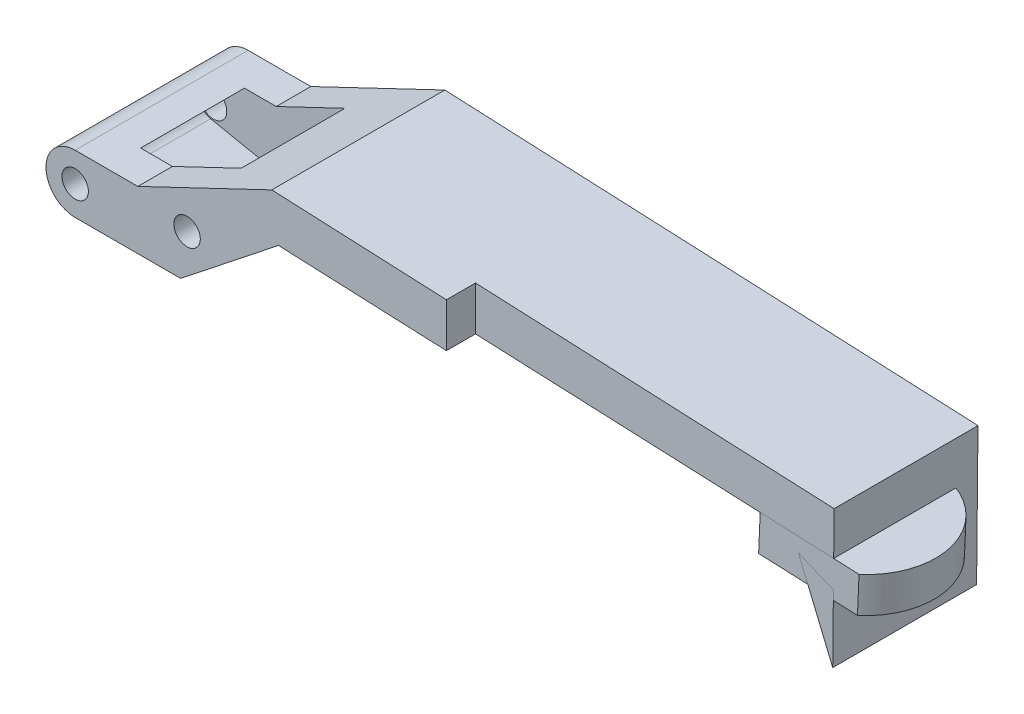
ISO-10303-21;
HEADER;
FILE_DESCRIPTION(('STEP AP214'),'2;1');
FILE_NAME('part.step','',(''),(''),'','','');
FILE_SCHEMA(('AUTOMOTIVE_DESIGN { 1 0 10303 214 1 1 1 1 }'));
ENDSEC;
DATA;
#1=APPLICATION_CONTEXT('core data for automotive mechanical design processes');
#2=APPLICATION_PROTOCOL_DEFINITION('international standard','automotive_design',2000,#1);
#3=PRODUCT_CONTEXT('',#1,'mechanical');
#4=PRODUCT('Part','Part','',(#3));
#5=PRODUCT_RELATED_PRODUCT_CATEGORY('part','',(#4));
#6=PRODUCT_DEFINITION_FORMATION('','',#4);
#7=PRODUCT_DEFINITION_CONTEXT('part definition',#1,'design');
#8=PRODUCT_DEFINITION('design','',#6,#7);
#9=PRODUCT_DEFINITION_SHAPE('','',#8);
#10=(LENGTH_UNIT() NAMED_UNIT(*) SI_UNIT(.MILLI.,.METRE.));
#11=(NAMED_UNIT(*) PLANE_ANGLE_UNIT() SI_UNIT($,.RADIAN.));
#12=(NAMED_UNIT(*) SI_UNIT($,.STERADIAN.) SOLID_ANGLE_UNIT());
#13=UNCERTAINTY_MEASURE_WITH_UNIT(LENGTH_MEASURE(1.E-05),#10,'distance_accuracy_value','');
#14=(GEOMETRIC_REPRESENTATION_CONTEXT(3) GLOBAL_UNCERTAINTY_ASSIGNED_CONTEXT((#13)) GLOBAL_UNIT_ASSIGNED_CONTEXT((#10,
#11,#12)) REPRESENTATION_CONTEXT('',''));
#15=CARTESIAN_POINT('',(0.,0.,0.));
#16=DIRECTION('',(0.,0.,1.));
#17=DIRECTION('',(1.,0.,0.));
#18=AXIS2_PLACEMENT_3D('',#15,#16,#17);
#19=CARTESIAN_POINT('',(69.4170686854287,12.3565905294232,14.8172482104849));
#20=DIRECTION('',(0.0429586518473279,0.999076851013705,0.));
#21=DIRECTION('',(-0.999076851013705,0.0429586518473279,0.));
#22=AXIS2_PLACEMENT_3D('',#19,#20,#21);
#23=CYLINDRICAL_SURFACE('',#22,20.);
#24=CARTESIAN_POINT('',(69.4170686854287,12.3565905294232,14.8172482104849));
#25=DIRECTION('',(-0.0429586518473279,-0.999076851013705,0.));
#26=DIRECTION('',(0.999076851013705,-0.0429586518473279,0.));
#27=AXIS2_PLACEMENT_3D('',#24,#25,#26);
#28=CIRCLE('',#27,20.);
#29=CARTESIAN_POINT('',(55.8495903388643,12.9399696540069,29.5));
#30=VERTEX_POINT('',#29);
#31=CARTESIAN_POINT('',(82.984547031993,11.7732114048395,29.5));
#32=VERTEX_POINT('',#31);
#33=EDGE_CURVE('E56',#30,#32,#28,.T.);
#34=ORIENTED_EDGE('',*,*,#33,.F.);
#35=DIRECTION('',(0.0429586518473279,0.999076851013705,0.));
#36=VECTOR('',#35,1.);
#37=CARTESIAN_POINT('',(55.8495903388643,12.9399696540069,29.5));
#38=LINE('',#37,#36);
#39=CARTESIAN_POINT('',(56.2791768573376,22.930738164144,29.5));
#40=VERTEX_POINT('',#39);
#41=EDGE_CURVE('E67',#30,#40,#38,.T.);
#42=ORIENTED_EDGE('',*,*,#41,.T.);
#43=CARTESIAN_POINT('',(69.8466552039019,22.3473590395603,14.8172482104849));
#44=DIRECTION('',(-0.0429586518473279,-0.999076851013705,0.));
#45=DIRECTION('',(0.999076851013705,-0.0429586518473279,0.));
#46=AXIS2_PLACEMENT_3D('',#43,#44,#45);
#47=CIRCLE('',#46,20.);
#48=CARTESIAN_POINT('',(83.4141335504662,21.7639799149766,29.5));
#49=VERTEX_POINT('',#48);
#50=EDGE_CURVE('E78',#40,#49,#47,.T.);
#51=ORIENTED_EDGE('',*,*,#50,.T.);
#52=DIRECTION('',(0.0429586518473279,0.999076851013705,0.));
#53=VECTOR('',#52,1.);
#54=CARTESIAN_POINT('',(82.984547031993,11.7732114048395,29.5));
#55=LINE('',#54,#53);
#56=EDGE_CURVE('E63',#49,#32,#55,.F.);
#57=ORIENTED_EDGE('',*,*,#56,.T.);
#58=EDGE_LOOP('',(#34,#42,#51,#57));
#59=FACE_BOUND('',#58,.T.);
#60=ADVANCED_FACE('F49',(#59),#23,.T.);
#61=CARTESIAN_POINT('',(69.4170686854287,12.3565905294232,14.8172482104849));
#62=DIRECTION('',(-0.0429586518473279,-0.999076851013705,0.));
#63=DIRECTION('',(0.999076851013705,-0.0429586518473279,0.));
#64=AXIS2_PLACEMENT_3D('',#61,#62,#63);
#65=PLANE('',#64);
#66=DIRECTION('',(0.999076851013705,-0.0429586518473279,0.));
#67=VECTOR('',#66,1.);
#68=CARTESIAN_POINT('',(69.4170686854287,12.3565905294232,29.5));
#69=LINE('',#68,#67);
#70=EDGE_CURVE('E80',#30,#32,#69,.T.);
#71=ORIENTED_EDGE('',*,*,#70,.F.);
#72=ORIENTED_EDGE('',*,*,#33,.T.);
#73=EDGE_LOOP('',(#71,#72));
#74=FACE_BOUND('',#73,.T.);
#75=ADVANCED_FACE('F87',(#74),#65,.T.);
#76=CARTESIAN_POINT('',(69.8466552039019,22.3473590395603,14.8172482104849));
#77=DIRECTION('',(-0.0429586518473279,-0.999076851013705,0.));
#78=DIRECTION('',(0.999076851013705,-0.0429586518473279,0.));
#79=AXIS2_PLACEMENT_3D('',#76,#77,#78);
#80=PLANE('',#79);
#81=ORIENTED_EDGE('',*,*,#50,.F.);
#82=DIRECTION('',(0.999076851013705,-0.0429586518473279,0.));
#83=VECTOR('',#82,1.);
#84=CARTESIAN_POINT('',(69.8466552039019,22.3473590395603,29.5));
#85=LINE('',#84,#83);
#86=EDGE_CURVE('E12',#40,#49,#85,.T.);
#87=ORIENTED_EDGE('',*,*,#86,.T.);
#88=EDGE_LOOP('',(#81,#87));
#89=FACE_BOUND('',#88,.T.);
#90=ADVANCED_FACE('F82',(#89),#80,.F.);
#91=CARTESIAN_POINT('',(0.,0.,29.5));
#92=DIRECTION('',(0.,0.,-1.));
#93=DIRECTION('',(-1.,0.,0.));
#94=AXIS2_PLACEMENT_3D('',#91,#92,#93);
#95=PLANE('',#94);
#96=ORIENTED_EDGE('',*,*,#70,.T.);
#97=ORIENTED_EDGE('',*,*,#56,.F.);
#98=ORIENTED_EDGE('',*,*,#86,.F.);
#99=ORIENTED_EDGE('',*,*,#41,.F.);
#100=EDGE_LOOP('',(#96,#97,#98,#99));
#101=FACE_BOUND('',#100,.T.);
#102=ADVANCED_FACE('F72',(#101),#95,.F.);
#103=CLOSED_SHELL('',(#60,#75,#90,#102));
#104=MANIFOLD_SOLID_BREP('B2',#103);
#105=CARTESIAN_POINT('',(-93.0725933015638,19.0392325507542,260.60568478364));
#106=DIRECTION('',(0.,0.,-1.));
#107=DIRECTION('',(-1.,0.,0.));
#108=AXIS2_PLACEMENT_3D('',#105,#106,#107);
#109=CYLINDRICAL_SURFACE('',#108,3.62850408907859);
#110=CARTESIAN_POINT('',(-93.0725933015638,19.0392325507542,-10.));
#111=DIRECTION('',(0.,0.,1.));
#112=DIRECTION('',(1.,0.,0.));
#113=AXIS2_PLACEMENT_3D('',#110,#111,#112);
#114=CIRCLE('',#113,3.62850408907859);
#115=CARTESIAN_POINT('',(-89.4440892124852,19.0392325507542,-10.));
#116=VERTEX_POINT('',#115);
#117=EDGE_CURVE('E304',#116,#116,#114,.F.);
#118=ORIENTED_EDGE('',*,*,#117,.T.);
#119=EDGE_LOOP('',(#118));
#120=FACE_BOUND('',#119,.T.);
#121=CARTESIAN_POINT('',(-93.0725933015638,19.0392325507542,-0.5));
#122=DIRECTION('',(0.,0.,1.));
#123=DIRECTION('',(1.,0.,0.));
#124=AXIS2_PLACEMENT_3D('',#121,#122,#123);
#125=CIRCLE('',#124,3.62850408907859);
#126=CARTESIAN_POINT('',(-89.4440892124852,19.0392325507542,-0.5));
#127=VERTEX_POINT('',#126);
#128=EDGE_CURVE('E362',#127,#127,#125,.T.);
#129=ORIENTED_EDGE('',*,*,#128,.T.);
#130=EDGE_LOOP('',(#129));
#131=FACE_BOUND('',#130,.T.);
#132=ADVANCED_FACE('F121',(#120,#131),#109,.F.);
#133=CARTESIAN_POINT('',(-94.8311183946456,7.,260.60568478364));
#134=DIRECTION('',(-0.620941950223322,0.783856552216576,0.));
#135=DIRECTION('',(-0.783856552216576,-0.620941950223322,0.));
#136=AXIS2_PLACEMENT_3D('',#133,#134,#135);
#137=PLANE('',#136);
#138=DIRECTION('',(0.783856552216576,0.620941950223322,0.));
#139=VECTOR('',#138,1.);
#140=CARTESIAN_POINT('',(-94.8311183946456,7.,-0.5));
#141=LINE('',#140,#139);
#142=CARTESIAN_POINT('',(-94.8311183946456,7.,-0.5));
#143=VERTEX_POINT('',#142);
#144=CARTESIAN_POINT('',(-79.0401530054826,19.509014330401,-0.5));
#145=VERTEX_POINT('',#144);
#146=EDGE_CURVE('E360',#143,#145,#141,.T.);
#147=ORIENTED_EDGE('',*,*,#146,.F.);
#148=DIRECTION('',(0.,0.,-1.));
#149=VECTOR('',#148,1.);
#150=CARTESIAN_POINT('',(-94.8311183946456,7.,260.60568478364));
#151=LINE('',#150,#149);
#152=CARTESIAN_POINT('',(-94.8311183946456,7.,-10.));
#153=VERTEX_POINT('',#152);
#154=EDGE_CURVE('E274',#143,#153,#151,.T.);
#155=ORIENTED_EDGE('',*,*,#154,.T.);
#156=DIRECTION('',(-0.783856552216576,-0.620941950223322,0.));
#157=VECTOR('',#156,1.);
#158=CARTESIAN_POINT('',(-94.8311183946456,7.,-10.));
#159=LINE('',#158,#157);
#160=CARTESIAN_POINT('',(-67.9761422699303,28.273511334347,-10.));
#161=VERTEX_POINT('',#160);
#162=EDGE_CURVE('E393',#161,#153,#159,.T.);
#163=ORIENTED_EDGE('',*,*,#162,.F.);
#164=DIRECTION('',(0.,0.,-1.));
#165=VECTOR('',#164,1.);
#166=CARTESIAN_POINT('',(-67.9761422699303,28.273511334347,260.60568478364));
#167=LINE('',#166,#165);
#168=CARTESIAN_POINT('',(-67.9761422699303,28.273511334347,37.5));
#169=VERTEX_POINT('',#168);
#170=EDGE_CURVE('E271',#169,#161,#167,.T.);
#171=ORIENTED_EDGE('',*,*,#170,.F.);
#172=DIRECTION('',(0.783856552216576,0.620941950223322,0.));
#173=VECTOR('',#172,1.);
#174=CARTESIAN_POINT('',(-94.8311183946456,7.,37.5));
#175=LINE('',#174,#173);
#176=CARTESIAN_POINT('',(-94.8311183946456,7.,37.5));
#177=VERTEX_POINT('',#176);
#178=EDGE_CURVE('E270',#177,#169,#175,.T.);
#179=ORIENTED_EDGE('',*,*,#178,.F.);
#180=CARTESIAN_POINT('',(-94.8311183946456,7.,28.));
#181=VERTEX_POINT('',#180);
#182=EDGE_CURVE('E280',#177,#181,#151,.T.);
#183=ORIENTED_EDGE('',*,*,#182,.T.);
#184=DIRECTION('',(0.783856552216576,0.620941950223322,0.));
#185=VECTOR('',#184,1.);
#186=CARTESIAN_POINT('',(-94.8311183946456,7.,28.));
#187=LINE('',#186,#185);
#188=CARTESIAN_POINT('',(-79.0401530054826,19.509014330401,28.));
#189=VERTEX_POINT('',#188);
#190=EDGE_CURVE('E144',#181,#189,#187,.T.);
#191=ORIENTED_EDGE('',*,*,#190,.T.);
#192=DIRECTION('',(0.,0.,1.));
#193=VECTOR('',#192,1.);
#194=CARTESIAN_POINT('',(-79.0401530054826,19.509014330401,-57.2848894963412));
#195=LINE('',#194,#193);
#196=EDGE_CURVE('E365',#189,#145,#195,.F.);
#197=ORIENTED_EDGE('',*,*,#196,.T.);
#198=EDGE_LOOP('',(#147,#155,#163,#171,#179,#183,#191,#197));
#199=FACE_BOUND('',#198,.T.);
#200=ADVANCED_FACE('F440',(#199),#137,.F.);
#201=CARTESIAN_POINT('',(-123.808315196469,7.,260.60568478364));
#202=DIRECTION('',(0.,1.,0.));
#203=DIRECTION('',(0.,0.,1.));
#204=AXIS2_PLACEMENT_3D('',#201,#202,#203);
#205=PLANE('',#204);
#206=DIRECTION('',(1.,0.,0.));
#207=VECTOR('',#206,1.);
#208=CARTESIAN_POINT('',(-123.808315196469,7.,-0.5));
#209=LINE('',#208,#207);
#210=CARTESIAN_POINT('',(-104.395423960864,7.,-0.5));
#211=VERTEX_POINT('',#210);
#212=EDGE_CURVE('E326',#211,#143,#209,.T.);
#213=ORIENTED_EDGE('',*,*,#212,.F.);
#214=DIRECTION('',(0.,0.,1.));
#215=VECTOR('',#214,1.);
#216=CARTESIAN_POINT('',(-104.395423960864,7.,260.60568478364));
#217=LINE('',#216,#215);
#218=CARTESIAN_POINT('',(-104.395423960864,7.,28.));
#219=VERTEX_POINT('',#218);
#220=EDGE_CURVE('E258',#211,#219,#217,.T.);
#221=ORIENTED_EDGE('',*,*,#220,.T.);
#222=DIRECTION('',(1.,0.,0.));
#223=VECTOR('',#222,1.);
#224=CARTESIAN_POINT('',(-123.808315196469,7.,28.));
#225=LINE('',#224,#223);
#226=EDGE_CURVE('E324',#219,#181,#225,.T.);
#227=ORIENTED_EDGE('',*,*,#226,.T.);
#228=ORIENTED_EDGE('',*,*,#182,.F.);
#229=DIRECTION('',(1.,0.,0.));
#230=VECTOR('',#229,1.);
#231=CARTESIAN_POINT('',(-123.808315196469,7.,37.5));
#232=LINE('',#231,#230);
#233=CARTESIAN_POINT('',(-123.808315196469,7.,37.5));
#234=VERTEX_POINT('',#233);
#235=EDGE_CURVE('E403',#234,#177,#232,.T.);
#236=ORIENTED_EDGE('',*,*,#235,.F.);
#237=DIRECTION('',(0.,0.,-1.));
#238=VECTOR('',#237,1.);
#239=CARTESIAN_POINT('',(-123.808315196469,7.,260.60568478364));
#240=LINE('',#239,#238);
#241=CARTESIAN_POINT('',(-123.808315196469,7.,-10.));
#242=VERTEX_POINT('',#241);
#243=EDGE_CURVE('E283',#234,#242,#240,.T.);
#244=ORIENTED_EDGE('',*,*,#243,.T.);
#245=DIRECTION('',(-1.,0.,0.));
#246=VECTOR('',#245,1.);
#247=CARTESIAN_POINT('',(-123.808315196469,7.,-10.));
#248=LINE('',#247,#246);
#249=EDGE_CURVE('E390',#153,#242,#248,.T.);
#250=ORIENTED_EDGE('',*,*,#249,.F.);
#251=ORIENTED_EDGE('',*,*,#154,.F.);
#252=EDGE_LOOP('',(#213,#221,#227,#228,#236,#244,#250,#251));
#253=FACE_BOUND('',#252,.T.);
#254=ADVANCED_FACE('F323',(#253),#205,.F.);
#255=CARTESIAN_POINT('',(-123.808315196469,23.,260.60568478364));
#256=DIRECTION('',(0.,-1.,0.));
#257=DIRECTION('',(0.,0.,-1.));
#258=AXIS2_PLACEMENT_3D('',#255,#256,#257);
#259=PLANE('',#258);
#260=DIRECTION('',(-1.,0.,0.));
#261=VECTOR('',#260,1.);
#262=CARTESIAN_POINT('',(-123.808315196469,23.,-0.5));
#263=LINE('',#262,#261);
#264=CARTESIAN_POINT('',(-106.59703978523,23.,-0.5));
#265=VERTEX_POINT('',#264);
#266=CARTESIAN_POINT('',(-115.332613788955,23.,-0.5));
#267=VERTEX_POINT('',#266);
#268=EDGE_CURVE('E357',#265,#267,#263,.T.);
#269=ORIENTED_EDGE('',*,*,#268,.F.);
#270=DIRECTION('',(0.,0.,-1.));
#271=VECTOR('',#270,1.);
#272=CARTESIAN_POINT('',(-106.59703978523,23.,260.60568478364));
#273=LINE('',#272,#271);
#274=CARTESIAN_POINT('',(-106.59703978523,23.,-10.));
#275=VERTEX_POINT('',#274);
#276=EDGE_CURVE('E287',#265,#275,#273,.T.);
#277=ORIENTED_EDGE('',*,*,#276,.T.);
#278=DIRECTION('',(1.,0.,0.));
#279=VECTOR('',#278,1.);
#280=CARTESIAN_POINT('',(-123.808315196469,23.,-10.));
#281=LINE('',#280,#279);
#282=CARTESIAN_POINT('',(-123.808315196469,23.,-10.));
#283=VERTEX_POINT('',#282);
#284=EDGE_CURVE('E384',#283,#275,#281,.T.);
#285=ORIENTED_EDGE('',*,*,#284,.F.);
#286=DIRECTION('',(0.,0.,-1.));
#287=VECTOR('',#286,1.);
#288=CARTESIAN_POINT('',(-123.808315196469,23.,260.60568478364));
#289=LINE('',#288,#287);
#290=CARTESIAN_POINT('',(-123.808315196469,23.,37.5));
#291=VERTEX_POINT('',#290);
#292=EDGE_CURVE('E285',#291,#283,#289,.T.);
#293=ORIENTED_EDGE('',*,*,#292,.F.);
#294=DIRECTION('',(-1.,0.,0.));
#295=VECTOR('',#294,1.);
#296=CARTESIAN_POINT('',(-123.808315196469,23.,37.5));
#297=LINE('',#296,#295);
#298=CARTESIAN_POINT('',(-106.59703978523,23.,37.5));
#299=VERTEX_POINT('',#298);
#300=EDGE_CURVE('E408',#299,#291,#297,.T.);
#301=ORIENTED_EDGE('',*,*,#300,.F.);
#302=CARTESIAN_POINT('',(-106.59703978523,23.,28.));
#303=VERTEX_POINT('',#302);
#304=EDGE_CURVE('E288',#299,#303,#273,.T.);
#305=ORIENTED_EDGE('',*,*,#304,.T.);
#306=DIRECTION('',(-1.,0.,0.));
#307=VECTOR('',#306,1.);
#308=CARTESIAN_POINT('',(-123.808315196469,23.,28.));
#309=LINE('',#308,#307);
#310=CARTESIAN_POINT('',(-115.332613788955,23.,28.));
#311=VERTEX_POINT('',#310);
#312=EDGE_CURVE('E349',#303,#311,#309,.T.);
#313=ORIENTED_EDGE('',*,*,#312,.T.);
#314=DIRECTION('',(0.,0.,-1.));
#315=VECTOR('',#314,1.);
#316=CARTESIAN_POINT('',(-115.332613788955,23.,260.60568478364));
#317=LINE('',#316,#315);
#318=EDGE_CURVE('E317',#311,#267,#317,.T.);
#319=ORIENTED_EDGE('',*,*,#318,.T.);
#320=EDGE_LOOP('',(#269,#277,#285,#293,#301,#305,#313,#319));
#321=FACE_BOUND('',#320,.T.);
#322=ADVANCED_FACE('F450',(#321),#259,.F.);
#323=CARTESIAN_POINT('',(-106.59703978523,23.,260.60568478364));
#324=DIRECTION('',(0.430894593675026,-0.902402265700632,0.));
#325=DIRECTION('',(0.902402265700632,0.430894593675026,0.));
#326=AXIS2_PLACEMENT_3D('',#323,#324,#325);
#327=PLANE('',#326);
#328=DIRECTION('',(-0.902402265700632,-0.430894593675026,0.));
#329=VECTOR('',#328,1.);
#330=CARTESIAN_POINT('',(-106.59703978523,23.,-0.5));
#331=LINE('',#330,#329);
#332=CARTESIAN_POINT('',(-87.7138484569898,32.0166717925431,-0.5));
#333=VERTEX_POINT('',#332);
#334=EDGE_CURVE('E313',#333,#265,#331,.T.);
#335=ORIENTED_EDGE('',*,*,#334,.F.);
#336=DIRECTION('',(0.,0.,1.));
#337=VECTOR('',#336,1.);
#338=CARTESIAN_POINT('',(-87.7138484569898,32.0166717925431,-57.2848894963412));
#339=LINE('',#338,#337);
#340=CARTESIAN_POINT('',(-87.7138484569898,32.0166717925431,28.));
#341=VERTEX_POINT('',#340);
#342=EDGE_CURVE('E299',#333,#341,#339,.T.);
#343=ORIENTED_EDGE('',*,*,#342,.T.);
#344=DIRECTION('',(-0.902402265700632,-0.430894593675026,0.));
#345=VECTOR('',#344,1.);
#346=CARTESIAN_POINT('',(-106.59703978523,23.,28.));
#347=LINE('',#346,#345);
#348=EDGE_CURVE('E308',#341,#303,#347,.T.);
#349=ORIENTED_EDGE('',*,*,#348,.T.);
#350=ORIENTED_EDGE('',*,*,#304,.F.);
#351=DIRECTION('',(-0.902402265700632,-0.430894593675026,0.));
#352=VECTOR('',#351,1.);
#353=CARTESIAN_POINT('',(-106.59703978523,23.,37.5));
#354=LINE('',#353,#352);
#355=CARTESIAN_POINT('',(-69.8134079377296,40.5640827835406,37.5));
#356=VERTEX_POINT('',#355);
#357=EDGE_CURVE('E276',#356,#299,#354,.T.);
#358=ORIENTED_EDGE('',*,*,#357,.F.);
#359=DIRECTION('',(0.,0.,-1.));
#360=VECTOR('',#359,1.);
#361=CARTESIAN_POINT('',(-69.8134079377296,40.5640827835406,260.60568478364));
#362=LINE('',#361,#360);
#363=CARTESIAN_POINT('',(-69.8134079377296,40.5640827835406,-10.));
#364=VERTEX_POINT('',#363);
#365=EDGE_CURVE('E291',#356,#364,#362,.T.);
#366=ORIENTED_EDGE('',*,*,#365,.T.);
#367=DIRECTION('',(0.902402265700632,0.430894593675026,0.));
#368=VECTOR('',#367,1.);
#369=CARTESIAN_POINT('',(-106.59703978523,23.,-10.));
#370=LINE('',#369,#368);
#371=EDGE_CURVE('E381',#275,#364,#370,.T.);
#372=ORIENTED_EDGE('',*,*,#371,.F.);
#373=ORIENTED_EDGE('',*,*,#276,.F.);
#374=EDGE_LOOP('',(#335,#343,#349,#350,#358,#366,#372,#373));
#375=FACE_BOUND('',#374,.T.);
#376=ADVANCED_FACE('F416',(#375),#327,.F.);
#377=CARTESIAN_POINT('',(-123.808315196469,15.,260.60568478364));
#378=DIRECTION('',(0.,0.,-1.));
#379=DIRECTION('',(-1.,0.,0.));
#380=AXIS2_PLACEMENT_3D('',#377,#378,#379);
#381=CYLINDRICAL_SURFACE('',#380,3.62850408907861);
#382=CARTESIAN_POINT('',(-123.808315196469,15.,-10.));
#383=DIRECTION('',(0.,0.,1.));
#384=DIRECTION('',(1.,0.,0.));
#385=AXIS2_PLACEMENT_3D('',#382,#383,#384);
#386=CIRCLE('',#385,3.62850408907861);
#387=CARTESIAN_POINT('',(-120.17981110739,15.,-10.));
#388=VERTEX_POINT('',#387);
#389=EDGE_CURVE('E371',#388,#388,#386,.F.);
#390=ORIENTED_EDGE('',*,*,#389,.T.);
#391=EDGE_LOOP('',(#390));
#392=FACE_BOUND('',#391,.T.);
#393=CARTESIAN_POINT('',(-123.808315196469,15.,-0.5));
#394=DIRECTION('',(0.,0.,1.));
#395=DIRECTION('',(1.,0.,0.));
#396=AXIS2_PLACEMENT_3D('',#393,#394,#395);
#397=CIRCLE('',#396,3.62850408907861);
#398=CARTESIAN_POINT('',(-120.17981110739,15.,-0.5));
#399=VERTEX_POINT('',#398);
#400=EDGE_CURVE('E310',#399,#399,#397,.T.);
#401=ORIENTED_EDGE('',*,*,#400,.T.);
#402=EDGE_LOOP('',(#401));
#403=FACE_BOUND('',#402,.T.);
#404=ADVANCED_FACE('F502',(#392,#403),#381,.F.);
#405=CARTESIAN_POINT('',(-93.0725933015638,19.0392325507542,28.));
#406=DIRECTION('',(0.,0.,1.));
#407=DIRECTION('',(1.,0.,0.));
#408=AXIS2_PLACEMENT_3D('',#405,#406,#407);
#409=CIRCLE('',#408,3.62850408907859);
#410=CARTESIAN_POINT('',(-89.4440892124852,19.0392325507542,28.));
#411=VERTEX_POINT('',#410);
#412=EDGE_CURVE('E314',#411,#411,#409,.T.);
#413=ORIENTED_EDGE('',*,*,#412,.F.);
#414=EDGE_LOOP('',(#413));
#415=FACE_BOUND('',#414,.T.);
#416=CARTESIAN_POINT('',(-93.0725933015638,19.0392325507542,37.5));
#417=DIRECTION('',(0.,0.,1.));
#418=DIRECTION('',(1.,0.,0.));
#419=AXIS2_PLACEMENT_3D('',#416,#417,#418);
#420=CIRCLE('',#419,3.62850408907859);
#421=CARTESIAN_POINT('',(-89.4440892124852,19.0392325507542,37.5));
#422=VERTEX_POINT('',#421);
#423=EDGE_CURVE('E303',#422,#422,#420,.T.);
#424=ORIENTED_EDGE('',*,*,#423,.T.);
#425=EDGE_LOOP('',(#424));
#426=FACE_BOUND('',#425,.T.);
#427=ADVANCED_FACE('F493',(#415,#426),#109,.F.);
#428=CARTESIAN_POINT('',(-123.808315196469,15.,260.60568478364));
#429=DIRECTION('',(0.,0.,-1.));
#430=DIRECTION('',(-1.,0.,0.));
#431=AXIS2_PLACEMENT_3D('',#428,#429,#430);
#432=CYLINDRICAL_SURFACE('',#431,8.);
#433=CARTESIAN_POINT('',(-123.808315196469,15.,37.5));
#434=DIRECTION('',(0.,0.,1.));
#435=DIRECTION('',(1.,0.,0.));
#436=AXIS2_PLACEMENT_3D('',#433,#434,#435);
#437=CIRCLE('',#436,8.);
#438=EDGE_CURVE('E405',#291,#234,#437,.T.);
#439=ORIENTED_EDGE('',*,*,#438,.F.);
#440=ORIENTED_EDGE('',*,*,#292,.T.);
#441=CARTESIAN_POINT('',(-123.808315196469,15.,-10.));
#442=DIRECTION('',(0.,0.,1.));
#443=DIRECTION('',(1.,0.,0.));
#444=AXIS2_PLACEMENT_3D('',#441,#442,#443);
#445=CIRCLE('',#444,8.);
#446=EDGE_CURVE('E387',#242,#283,#445,.F.);
#447=ORIENTED_EDGE('',*,*,#446,.F.);
#448=ORIENTED_EDGE('',*,*,#243,.F.);
#449=EDGE_LOOP('',(#439,#440,#447,#448));
#450=FACE_BOUND('',#449,.T.);
#451=ADVANCED_FACE('F445',(#450),#432,.T.);
#452=CARTESIAN_POINT('',(-69.8134079377296,40.5640827835406,260.60568478364));
#453=DIRECTION('',(-0.0450408761212035,-0.998985144773552,0.));
#454=DIRECTION('',(0.998985144773552,-0.0450408761212035,0.));
#455=AXIS2_PLACEMENT_3D('',#452,#453,#454);
#456=PLANE('',#455);
#457=DIRECTION('',(-0.998985144773552,0.0450408761212035,0.));
#458=VECTOR('',#457,1.);
#459=CARTESIAN_POINT('',(-69.8134079377296,40.5640827835406,37.5));
#460=LINE('',#459,#458);
#461=CARTESIAN_POINT('',(-21.8746114044652,38.402683880513,37.5));
#462=VERTEX_POINT('',#461);
#463=EDGE_CURVE('E272',#462,#356,#460,.T.);
#464=ORIENTED_EDGE('',*,*,#463,.F.);
#465=DIRECTION('',(0.,0.,-1.));
#466=VECTOR('',#465,1.);
#467=CARTESIAN_POINT('',(-21.8746114044652,38.402683880513,260.60568478364));
#468=LINE('',#467,#466);
#469=CARTESIAN_POINT('',(-21.8746114044652,38.402683880513,29.5));
#470=VERTEX_POINT('',#469);
#471=EDGE_CURVE('E136',#462,#470,#468,.T.);
#472=ORIENTED_EDGE('',*,*,#471,.T.);
#473=DIRECTION('',(0.998985144773552,-0.0450408761212035,0.));
#474=VECTOR('',#473,1.);
#475=CARTESIAN_POINT('',(-69.8134079377296,40.5640827835406,29.5));
#476=LINE('',#475,#474);
#477=CARTESIAN_POINT('',(76.5795177343592,33.9637187393768,29.5));
#478=VERTEX_POINT('',#477);
#479=EDGE_CURVE('E465',#470,#478,#476,.T.);
#480=ORIENTED_EDGE('',*,*,#479,.T.);
#481=DIRECTION('',(0.,0.,-1.));
#482=VECTOR('',#481,1.);
#483=CARTESIAN_POINT('',(76.5795177343592,33.9637187393768,260.60568478364));
#484=LINE('',#483,#482);
#485=CARTESIAN_POINT('',(76.5795177343592,33.9637187393768,-10.));
#486=VERTEX_POINT('',#485);
#487=EDGE_CURVE('E293',#478,#486,#484,.T.);
#488=ORIENTED_EDGE('',*,*,#487,.T.);
#489=DIRECTION('',(0.998985144773552,-0.0450408761212035,0.));
#490=VECTOR('',#489,1.);
#491=CARTESIAN_POINT('',(-69.8134079377296,40.5640827835406,-10.));
#492=LINE('',#491,#490);
#493=EDGE_CURVE('E378',#364,#486,#492,.T.);
#494=ORIENTED_EDGE('',*,*,#493,.F.);
#495=ORIENTED_EDGE('',*,*,#365,.F.);
#496=EDGE_LOOP('',(#464,#472,#480,#488,#494,#495));
#497=FACE_BOUND('',#496,.T.);
#498=ADVANCED_FACE('F420',(#497),#456,.F.);
#499=CARTESIAN_POINT('',(76.5795177343592,33.9637187393768,260.60568478364));
#500=DIRECTION('',(-0.999947901593243,0.0102075510907739,0.));
#501=DIRECTION('',(-0.0102075510907739,-0.999947901593243,0.));
#502=AXIS2_PLACEMENT_3D('',#499,#500,#501);
#503=PLANE('',#502);
#504=ORIENTED_EDGE('',*,*,#487,.F.);
#505=DIRECTION('',(-0.0102075510907739,-0.999947901593243,0.));
#506=VECTOR('',#505,1.);
#507=CARTESIAN_POINT('',(76.5795177343592,33.9637187393768,29.5));
#508=LINE('',#507,#506);
#509=CARTESIAN_POINT('',(76.1916848035314,-4.02901055497371,29.5));
#510=VERTEX_POINT('',#509);
#511=EDGE_CURVE('E432',#478,#510,#508,.T.);
#512=ORIENTED_EDGE('',*,*,#511,.T.);
#513=DIRECTION('',(0.,0.,-1.));
#514=VECTOR('',#513,1.);
#515=CARTESIAN_POINT('',(76.1916848035314,-4.0290105549737,260.60568478364));
#516=LINE('',#515,#514);
#517=CARTESIAN_POINT('',(76.1916848035314,-4.0290105549737,-10.));
#518=VERTEX_POINT('',#517);
#519=EDGE_CURVE('E295',#510,#518,#516,.T.);
#520=ORIENTED_EDGE('',*,*,#519,.T.);
#521=DIRECTION('',(-0.0102075510907739,-0.999947901593243,0.));
#522=VECTOR('',#521,1.);
#523=CARTESIAN_POINT('',(76.5795177343592,33.9637187393768,-10.));
#524=LINE('',#523,#522);
#525=EDGE_CURVE('E368',#486,#518,#524,.T.);
#526=ORIENTED_EDGE('',*,*,#525,.F.);
#527=EDGE_LOOP('',(#504,#512,#520,#526));
#528=FACE_BOUND('',#527,.T.);
#529=ADVANCED_FACE('F429',(#528),#503,.F.);
#530=CARTESIAN_POINT('',(76.1916848035314,-4.0290105549737,260.60568478364));
#531=DIRECTION('',(0.923006832616529,0.384783558566635,0.));
#532=DIRECTION('',(-0.384783558566635,0.923006832616529,0.));
#533=AXIS2_PLACEMENT_3D('',#530,#531,#532);
#534=PLANE('',#533);
#535=ORIENTED_EDGE('',*,*,#519,.F.);
#536=DIRECTION('',(-0.384783558566635,0.923006832616529,0.));
#537=VECTOR('',#536,1.);
#538=CARTESIAN_POINT('',(76.1916848035314,-4.0290105549737,29.5));
#539=LINE('',#538,#537);
#540=CARTESIAN_POINT('',(65.1110030296393,22.5509842489901,29.5));
#541=VERTEX_POINT('',#540);
#542=EDGE_CURVE('E436',#510,#541,#539,.T.);
#543=ORIENTED_EDGE('',*,*,#542,.T.);
#544=DIRECTION('',(0.,0.,-1.));
#545=VECTOR('',#544,1.);
#546=CARTESIAN_POINT('',(65.1110030296393,22.5509842489901,260.60568478364));
#547=LINE('',#546,#545);
#548=CARTESIAN_POINT('',(65.1110030296393,22.5509842489901,-10.));
#549=VERTEX_POINT('',#548);
#550=EDGE_CURVE('E297',#541,#549,#547,.T.);
#551=ORIENTED_EDGE('',*,*,#550,.T.);
#552=DIRECTION('',(-0.384783558566635,0.923006832616529,0.));
#553=VECTOR('',#552,1.);
#554=CARTESIAN_POINT('',(76.1916848035314,-4.0290105549737,-10.));
#555=LINE('',#554,#553);
#556=EDGE_CURVE('E372',#518,#549,#555,.T.);
#557=ORIENTED_EDGE('',*,*,#556,.F.);
#558=EDGE_LOOP('',(#535,#543,#551,#557));
#559=FACE_BOUND('',#558,.T.);
#560=ADVANCED_FACE('F435',(#559),#534,.F.);
#561=CARTESIAN_POINT('',(-67.9761422699303,28.273511334347,260.60568478364));
#562=DIRECTION('',(0.0429586518473279,0.999076851013704,0.));
#563=DIRECTION('',(-0.999076851013705,0.0429586518473279,0.));
#564=AXIS2_PLACEMENT_3D('',#561,#562,#563);
#565=PLANE('',#564);
#566=DIRECTION('',(-0.999076851013705,0.0429586518473279,0.));
#567=VECTOR('',#566,1.);
#568=CARTESIAN_POINT('',(-67.9761422699303,28.273511334347,29.5));
#569=LINE('',#568,#567);
#570=CARTESIAN_POINT('',(-21.8746114044652,26.2912217716683,29.5));
#571=VERTEX_POINT('',#570);
#572=EDGE_CURVE('E47',#541,#571,#569,.T.);
#573=ORIENTED_EDGE('',*,*,#572,.T.);
#574=DIRECTION('',(0.,0.,1.));
#575=VECTOR('',#574,1.);
#576=CARTESIAN_POINT('',(-21.8746114044652,26.2912217716683,260.60568478364));
#577=LINE('',#576,#575);
#578=CARTESIAN_POINT('',(-21.8746114044652,26.2912217716683,37.5));
#579=VERTEX_POINT('',#578);
#580=EDGE_CURVE('E253',#571,#579,#577,.T.);
#581=ORIENTED_EDGE('',*,*,#580,.T.);
#582=DIRECTION('',(0.999076851013705,-0.0429586518473279,0.));
#583=VECTOR('',#582,1.);
#584=CARTESIAN_POINT('',(-67.9761422699303,28.273511334347,37.5));
#585=LINE('',#584,#583);
#586=EDGE_CURVE('E261',#169,#579,#585,.T.);
#587=ORIENTED_EDGE('',*,*,#586,.F.);
#588=ORIENTED_EDGE('',*,*,#170,.T.);
#589=DIRECTION('',(-0.999076851013705,0.0429586518473279,0.));
#590=VECTOR('',#589,1.);
#591=CARTESIAN_POINT('',(-67.9761422699303,28.273511334347,-10.));
#592=LINE('',#591,#590);
#593=EDGE_CURVE('E375',#549,#161,#592,.T.);
#594=ORIENTED_EDGE('',*,*,#593,.F.);
#595=ORIENTED_EDGE('',*,*,#550,.F.);
#596=EDGE_LOOP('',(#573,#581,#587,#588,#594,#595));
#597=FACE_BOUND('',#596,.T.);
#598=ADVANCED_FACE('F123',(#597),#565,.F.);
#599=CARTESIAN_POINT('',(-123.808315196469,15.,28.));
#600=DIRECTION('',(0.,0.,1.));
#601=DIRECTION('',(1.,0.,0.));
#602=AXIS2_PLACEMENT_3D('',#599,#600,#601);
#603=CIRCLE('',#602,3.62850408907861);
#604=CARTESIAN_POINT('',(-120.17981110739,15.,28.));
#605=VERTEX_POINT('',#604);
#606=EDGE_CURVE('E305',#605,#605,#603,.T.);
#607=ORIENTED_EDGE('',*,*,#606,.F.);
#608=EDGE_LOOP('',(#607));
#609=FACE_BOUND('',#608,.T.);
#610=CARTESIAN_POINT('',(-123.808315196469,15.,37.5));
#611=DIRECTION('',(0.,0.,1.));
#612=DIRECTION('',(1.,0.,0.));
#613=AXIS2_PLACEMENT_3D('',#610,#611,#612);
#614=CIRCLE('',#613,3.62850408907861);
#615=CARTESIAN_POINT('',(-120.17981110739,15.,37.5));
#616=VERTEX_POINT('',#615);
#617=EDGE_CURVE('E300',#616,#616,#614,.T.);
#618=ORIENTED_EDGE('',*,*,#617,.T.);
#619=EDGE_LOOP('',(#618));
#620=FACE_BOUND('',#619,.T.);
#621=ADVANCED_FACE('F511',(#609,#620),#381,.F.);
#622=CARTESIAN_POINT('',(0.,0.,37.5));
#623=DIRECTION('',(0.,0.,1.));
#624=DIRECTION('',(1.,0.,0.));
#625=AXIS2_PLACEMENT_3D('',#622,#623,#624);
#626=PLANE('',#625);
#627=DIRECTION('',(0.,-1.,0.));
#628=VECTOR('',#627,1.);
#629=CARTESIAN_POINT('',(-21.8746114044652,0.,37.5));
#630=LINE('',#629,#628);
#631=EDGE_CURVE('E129',#462,#579,#630,.T.);
#632=ORIENTED_EDGE('',*,*,#631,.F.);
#633=ORIENTED_EDGE('',*,*,#463,.T.);
#634=ORIENTED_EDGE('',*,*,#357,.T.);
#635=ORIENTED_EDGE('',*,*,#300,.T.);
#636=ORIENTED_EDGE('',*,*,#438,.T.);
#637=ORIENTED_EDGE('',*,*,#235,.T.);
#638=ORIENTED_EDGE('',*,*,#178,.T.);
#639=ORIENTED_EDGE('',*,*,#586,.T.);
#640=EDGE_LOOP('',(#632,#633,#634,#635,#636,#637,#638,#639));
#641=FACE_BOUND('',#640,.T.);
#642=ORIENTED_EDGE('',*,*,#617,.F.);
#643=EDGE_LOOP('',(#642));
#644=FACE_BOUND('',#643,.T.);
#645=ORIENTED_EDGE('',*,*,#423,.F.);
#646=EDGE_LOOP('',(#645));
#647=FACE_BOUND('',#646,.T.);
#648=ADVANCED_FACE('F266',(#641,#644,#647),#626,.T.);
#649=CARTESIAN_POINT('',(0.,0.,-10.));
#650=DIRECTION('',(0.,0.,1.));
#651=DIRECTION('',(1.,0.,0.));
#652=AXIS2_PLACEMENT_3D('',#649,#650,#651);
#653=PLANE('',#652);
#654=ORIENTED_EDGE('',*,*,#593,.T.);
#655=ORIENTED_EDGE('',*,*,#162,.T.);
#656=ORIENTED_EDGE('',*,*,#249,.T.);
#657=ORIENTED_EDGE('',*,*,#446,.T.);
#658=ORIENTED_EDGE('',*,*,#284,.T.);
#659=ORIENTED_EDGE('',*,*,#371,.T.);
#660=ORIENTED_EDGE('',*,*,#493,.T.);
#661=ORIENTED_EDGE('',*,*,#525,.T.);
#662=ORIENTED_EDGE('',*,*,#556,.T.);
#663=EDGE_LOOP('',(#654,#655,#656,#657,#658,#659,#660,#661,#662));
#664=FACE_BOUND('',#663,.T.);
#665=ORIENTED_EDGE('',*,*,#389,.F.);
#666=EDGE_LOOP('',(#665));
#667=FACE_BOUND('',#666,.T.);
#668=ORIENTED_EDGE('',*,*,#117,.F.);
#669=EDGE_LOOP('',(#668));
#670=FACE_BOUND('',#669,.T.);
#671=ADVANCED_FACE('F425',(#664,#667,#670),#653,.F.);
#672=CARTESIAN_POINT('',(-124.59993708417,11.0752673981965,-57.2848894963412));
#673=DIRECTION('',(-0.197719016838428,-0.980258736446886,0.));
#674=DIRECTION('',(0.980258736446886,-0.197719016838428,0.));
#675=AXIS2_PLACEMENT_3D('',#672,#673,#674);
#676=PLANE('',#675);
#677=DIRECTION('',(-0.980258736446886,0.197719016838428,0.));
#678=VECTOR('',#677,1.);
#679=CARTESIAN_POINT('',(-124.59993708417,11.0752673981965,-0.5));
#680=LINE('',#679,#678);
#681=CARTESIAN_POINT('',(-124.59993708417,11.0752673981965,-0.5));
#682=VERTEX_POINT('',#681);
#683=EDGE_CURVE('E309',#211,#682,#680,.T.);
#684=ORIENTED_EDGE('',*,*,#683,.T.);
#685=DIRECTION('',(0.,0.,1.));
#686=VECTOR('',#685,1.);
#687=CARTESIAN_POINT('',(-124.59993708417,11.0752673981965,-57.2848894963412));
#688=LINE('',#687,#686);
#689=CARTESIAN_POINT('',(-124.59993708417,11.0752673981965,28.));
#690=VERTEX_POINT('',#689);
#691=EDGE_CURVE('E345',#682,#690,#688,.T.);
#692=ORIENTED_EDGE('',*,*,#691,.T.);
#693=DIRECTION('',(0.980258736446886,-0.197719016838428,0.));
#694=VECTOR('',#693,1.);
#695=CARTESIAN_POINT('',(-124.59993708417,11.0752673981965,28.));
#696=LINE('',#695,#694);
#697=EDGE_CURVE('E333',#690,#219,#696,.T.);
#698=ORIENTED_EDGE('',*,*,#697,.T.);
#699=ORIENTED_EDGE('',*,*,#220,.F.);
#700=EDGE_LOOP('',(#684,#692,#698,#699));
#701=FACE_BOUND('',#700,.T.);
#702=ADVANCED_FACE('F330',(#701),#676,.F.);
#703=CARTESIAN_POINT('',(-123.393757619528,18.9822522803244,-57.2848894963412));
#704=DIRECTION('',(-0.446074178254461,0.894995993004778,0.));
#705=DIRECTION('',(-0.894995993004778,-0.446074178254461,0.));
#706=AXIS2_PLACEMENT_3D('',#703,#704,#705);
#707=PLANE('',#706);
#708=DIRECTION('',(-0.894995993004778,-0.446074178254461,0.));
#709=VECTOR('',#708,1.);
#710=CARTESIAN_POINT('',(-123.393757619528,18.9822522803244,28.));
#711=LINE('',#710,#709);
#712=CARTESIAN_POINT('',(-123.393757619528,18.9822522803244,28.));
#713=VERTEX_POINT('',#712);
#714=EDGE_CURVE('E462',#311,#713,#711,.T.);
#715=ORIENTED_EDGE('',*,*,#714,.T.);
#716=DIRECTION('',(0.,0.,1.));
#717=VECTOR('',#716,1.);
#718=CARTESIAN_POINT('',(-123.393757619528,18.9822522803244,-57.2848894963412));
#719=LINE('',#718,#717);
#720=CARTESIAN_POINT('',(-123.393757619528,18.9822522803244,-0.5));
#721=VERTEX_POINT('',#720);
#722=EDGE_CURVE('E457',#721,#713,#719,.T.);
#723=ORIENTED_EDGE('',*,*,#722,.F.);
#724=DIRECTION('',(0.894995993004778,0.446074178254461,0.));
#725=VECTOR('',#724,1.);
#726=CARTESIAN_POINT('',(-123.393757619528,18.9822522803244,-0.5));
#727=LINE('',#726,#725);
#728=EDGE_CURVE('E341',#721,#267,#727,.T.);
#729=ORIENTED_EDGE('',*,*,#728,.T.);
#730=ORIENTED_EDGE('',*,*,#318,.F.);
#731=EDGE_LOOP('',(#715,#723,#729,#730));
#732=FACE_BOUND('',#731,.T.);
#733=ADVANCED_FACE('F527',(#732),#707,.F.);
#734=CARTESIAN_POINT('',(-93.0725933015638,19.0392325507542,-57.2848894963412));
#735=DIRECTION('',(0.,0.,1.));
#736=DIRECTION('',(1.,0.,0.));
#737=AXIS2_PLACEMENT_3D('',#734,#735,#736);
#738=CYLINDRICAL_SURFACE('',#737,14.0403018337773);
#739=CARTESIAN_POINT('',(-93.0725933015638,19.0392325507542,28.));
#740=DIRECTION('',(0.,0.,1.));
#741=DIRECTION('',(1.,0.,0.));
#742=AXIS2_PLACEMENT_3D('',#739,#740,#741);
#743=CIRCLE('',#742,14.0403018337773);
#744=EDGE_CURVE('E469',#189,#341,#743,.T.);
#745=ORIENTED_EDGE('',*,*,#744,.T.);
#746=ORIENTED_EDGE('',*,*,#342,.F.);
#747=CARTESIAN_POINT('',(-93.0725933015638,19.0392325507542,-0.5));
#748=DIRECTION('',(0.,0.,1.));
#749=DIRECTION('',(1.,0.,0.));
#750=AXIS2_PLACEMENT_3D('',#747,#748,#749);
#751=CIRCLE('',#750,14.0403018337773);
#752=EDGE_CURVE('E455',#333,#145,#751,.F.);
#753=ORIENTED_EDGE('',*,*,#752,.T.);
#754=ORIENTED_EDGE('',*,*,#196,.F.);
#755=EDGE_LOOP('',(#745,#746,#753,#754));
#756=FACE_BOUND('',#755,.T.);
#757=ADVANCED_FACE('F528',(#756),#738,.F.);
#758=CARTESIAN_POINT('',(-123.808315196469,15.,-0.5));
#759=DIRECTION('',(0.,0.,1.));
#760=DIRECTION('',(1.,0.,0.));
#761=AXIS2_PLACEMENT_3D('',#758,#759,#760);
#762=PLANE('',#761);
#763=ORIENTED_EDGE('',*,*,#128,.F.);
#764=EDGE_LOOP('',(#763));
#765=FACE_BOUND('',#764,.T.);
#766=ORIENTED_EDGE('',*,*,#400,.F.);
#767=EDGE_LOOP('',(#766));
#768=FACE_BOUND('',#767,.T.);
#769=ORIENTED_EDGE('',*,*,#146,.T.);
#770=ORIENTED_EDGE('',*,*,#752,.F.);
#771=ORIENTED_EDGE('',*,*,#334,.T.);
#772=ORIENTED_EDGE('',*,*,#268,.T.);
#773=ORIENTED_EDGE('',*,*,#728,.F.);
#774=CARTESIAN_POINT('',(-123.808315196469,15.,-0.5));
#775=DIRECTION('',(0.,0.,1.));
#776=DIRECTION('',(1.,0.,0.));
#777=AXIS2_PLACEMENT_3D('',#774,#775,#776);
#778=CIRCLE('',#777,4.00377212247997);
#779=EDGE_CURVE('E338',#682,#721,#778,.F.);
#780=ORIENTED_EDGE('',*,*,#779,.F.);
#781=ORIENTED_EDGE('',*,*,#683,.F.);
#782=ORIENTED_EDGE('',*,*,#212,.T.);
#783=EDGE_LOOP('',(#769,#770,#771,#772,#773,#780,#781,#782));
#784=FACE_BOUND('',#783,.T.);
#785=ADVANCED_FACE('F335',(#765,#768,#784),#762,.T.);
#786=CARTESIAN_POINT('',(-123.808315196469,15.,28.));
#787=DIRECTION('',(0.,0.,1.));
#788=DIRECTION('',(1.,0.,0.));
#789=AXIS2_PLACEMENT_3D('',#786,#787,#788);
#790=PLANE('',#789);
#791=ORIENTED_EDGE('',*,*,#412,.T.);
#792=EDGE_LOOP('',(#791));
#793=FACE_BOUND('',#792,.T.);
#794=ORIENTED_EDGE('',*,*,#606,.T.);
#795=EDGE_LOOP('',(#794));
#796=FACE_BOUND('',#795,.T.);
#797=ORIENTED_EDGE('',*,*,#226,.F.);
#798=ORIENTED_EDGE('',*,*,#697,.F.);
#799=CARTESIAN_POINT('',(-123.808315196469,15.,28.));
#800=DIRECTION('',(0.,0.,1.));
#801=DIRECTION('',(1.,0.,0.));
#802=AXIS2_PLACEMENT_3D('',#799,#800,#801);
#803=CIRCLE('',#802,4.00377212247997);
#804=EDGE_CURVE('E464',#713,#690,#803,.T.);
#805=ORIENTED_EDGE('',*,*,#804,.F.);
#806=ORIENTED_EDGE('',*,*,#714,.F.);
#807=ORIENTED_EDGE('',*,*,#312,.F.);
#808=ORIENTED_EDGE('',*,*,#348,.F.);
#809=ORIENTED_EDGE('',*,*,#744,.F.);
#810=ORIENTED_EDGE('',*,*,#190,.F.);
#811=EDGE_LOOP('',(#797,#798,#805,#806,#807,#808,#809,#810));
#812=FACE_BOUND('',#811,.T.);
#813=ADVANCED_FACE('F487',(#793,#796,#812),#790,.F.);
#814=CARTESIAN_POINT('',(-123.808315196469,15.,-57.2848894963412));
#815=DIRECTION('',(0.,0.,1.));
#816=DIRECTION('',(1.,0.,0.));
#817=AXIS2_PLACEMENT_3D('',#814,#815,#816);
#818=CYLINDRICAL_SURFACE('',#817,4.00377212247997);
#819=ORIENTED_EDGE('',*,*,#779,.T.);
#820=ORIENTED_EDGE('',*,*,#722,.T.);
#821=ORIENTED_EDGE('',*,*,#804,.T.);
#822=ORIENTED_EDGE('',*,*,#691,.F.);
#823=EDGE_LOOP('',(#819,#820,#821,#822));
#824=FACE_BOUND('',#823,.T.);
#825=ADVANCED_FACE('F479',(#824),#818,.F.);
#826=CARTESIAN_POINT('',(0.,0.,29.5));
#827=DIRECTION('',(0.,0.,-1.));
#828=DIRECTION('',(-1.,0.,0.));
#829=AXIS2_PLACEMENT_3D('',#826,#827,#828);
#830=PLANE('',#829);
#831=DIRECTION('',(0.,-1.,0.));
#832=VECTOR('',#831,1.);
#833=CARTESIAN_POINT('',(-21.8746114044652,45.9298244689829,29.5));
#834=LINE('',#833,#832);
#835=EDGE_CURVE('E264',#470,#571,#834,.T.);
#836=ORIENTED_EDGE('',*,*,#835,.T.);
#837=ORIENTED_EDGE('',*,*,#572,.F.);
#838=ORIENTED_EDGE('',*,*,#542,.F.);
#839=ORIENTED_EDGE('',*,*,#511,.F.);
#840=ORIENTED_EDGE('',*,*,#479,.F.);
#841=EDGE_LOOP('',(#836,#837,#838,#839,#840));
#842=FACE_BOUND('',#841,.T.);
#843=ADVANCED_FACE('F477',(#842),#830,.F.);
#844=CARTESIAN_POINT('',(-21.8746114044652,45.9298244689829,29.5));
#845=DIRECTION('',(-1.,0.,0.));
#846=DIRECTION('',(0.,0.,1.));
#847=AXIS2_PLACEMENT_3D('',#844,#845,#846);
#848=PLANE('',#847);
#849=ORIENTED_EDGE('',*,*,#631,.T.);
#850=ORIENTED_EDGE('',*,*,#580,.F.);
#851=ORIENTED_EDGE('',*,*,#835,.F.);
#852=ORIENTED_EDGE('',*,*,#471,.F.);
#853=EDGE_LOOP('',(#849,#850,#851,#852));
#854=FACE_BOUND('',#853,.T.);
#855=ADVANCED_FACE('F252',(#854),#848,.F.);
#856=CLOSED_SHELL('',(#132,#200,#254,#322,#376,#404,#427,#451,#498,#529,#560,#598,#621,#648,
#671,#702,#733,#757,#785,#813,#825,#843,#855));
#857=MANIFOLD_SOLID_BREP('B6',#856);
#858=ADVANCED_BREP_SHAPE_REPRESENTATION('',(#18,#104,#857),#14);
#859=SHAPE_DEFINITION_REPRESENTATION(#9,#858);
ENDSEC;
END-ISO-10303-21;
